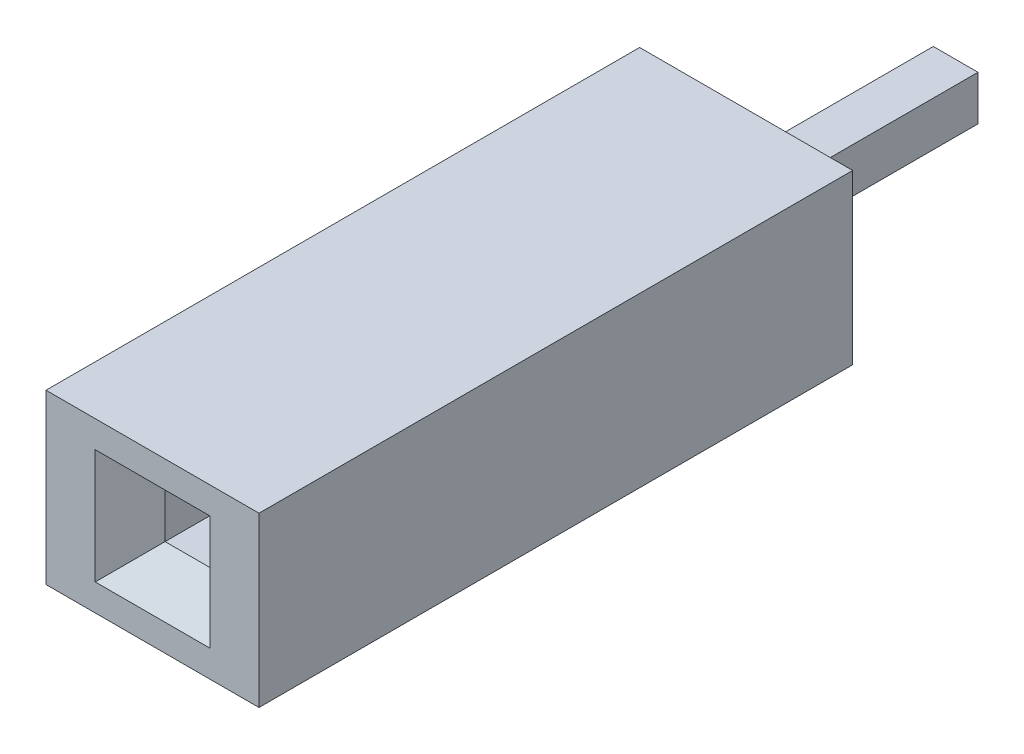
ISO-10303-21;
HEADER;
FILE_DESCRIPTION(('STEP AP214'),'2;1');
FILE_NAME('part.step','',(''),(''),'','','');
FILE_SCHEMA(('AUTOMOTIVE_DESIGN { 1 0 10303 214 1 1 1 1 }'));
ENDSEC;
DATA;
#1=APPLICATION_CONTEXT('core data for automotive mechanical design processes');
#2=APPLICATION_PROTOCOL_DEFINITION('international standard','automotive_design',2000,#1);
#3=PRODUCT_CONTEXT('',#1,'mechanical');
#4=PRODUCT('Part','Part','',(#3));
#5=PRODUCT_RELATED_PRODUCT_CATEGORY('part','',(#4));
#6=PRODUCT_DEFINITION_FORMATION('','',#4);
#7=PRODUCT_DEFINITION_CONTEXT('part definition',#1,'design');
#8=PRODUCT_DEFINITION('design','',#6,#7);
#9=PRODUCT_DEFINITION_SHAPE('','',#8);
#10=(LENGTH_UNIT() NAMED_UNIT(*) SI_UNIT(.MILLI.,.METRE.));
#11=(NAMED_UNIT(*) PLANE_ANGLE_UNIT() SI_UNIT($,.RADIAN.));
#12=(NAMED_UNIT(*) SI_UNIT($,.STERADIAN.) SOLID_ANGLE_UNIT());
#13=UNCERTAINTY_MEASURE_WITH_UNIT(LENGTH_MEASURE(1.E-05),#10,'distance_accuracy_value','');
#14=(GEOMETRIC_REPRESENTATION_CONTEXT(3) GLOBAL_UNCERTAINTY_ASSIGNED_CONTEXT((#13)) GLOBAL_UNIT_ASSIGNED_CONTEXT((#10,
#11,#12)) REPRESENTATION_CONTEXT('',''));
#15=CARTESIAN_POINT('',(0.,0.,0.));
#16=DIRECTION('',(0.,0.,1.));
#17=DIRECTION('',(1.,0.,0.));
#18=AXIS2_PLACEMENT_3D('',#15,#16,#17);
#19=CARTESIAN_POINT('',(0.,0.,0.));
#20=DIRECTION('',(0.,0.,1.));
#21=DIRECTION('',(1.,0.,0.));
#22=AXIS2_PLACEMENT_3D('',#19,#20,#21);
#23=PLANE('',#22);
#24=DIRECTION('',(0.,-1.,0.));
#25=VECTOR('',#24,1.);
#26=CARTESIAN_POINT('',(-1.525,1.205,0.));
#27=LINE('',#26,#25);
#28=CARTESIAN_POINT('',(-1.525,1.205,0.));
#29=VERTEX_POINT('',#28);
#30=CARTESIAN_POINT('',(-1.525,-1.205,0.));
#31=VERTEX_POINT('',#30);
#32=EDGE_CURVE('E207',#29,#31,#27,.T.);
#33=ORIENTED_EDGE('',*,*,#32,.F.);
#34=DIRECTION('',(1.,0.,0.));
#35=VECTOR('',#34,1.);
#36=CARTESIAN_POINT('',(-1.525,1.205,0.));
#37=LINE('',#36,#35);
#38=CARTESIAN_POINT('',(1.525,1.205,0.));
#39=VERTEX_POINT('',#38);
#40=EDGE_CURVE('E212',#29,#39,#37,.T.);
#41=ORIENTED_EDGE('',*,*,#40,.T.);
#42=DIRECTION('',(0.,-1.,0.));
#43=VECTOR('',#42,1.);
#44=CARTESIAN_POINT('',(1.525,1.205,0.));
#45=LINE('',#44,#43);
#46=CARTESIAN_POINT('',(1.525,-1.205,0.));
#47=VERTEX_POINT('',#46);
#48=EDGE_CURVE('E226',#39,#47,#45,.T.);
#49=ORIENTED_EDGE('',*,*,#48,.T.);
#50=DIRECTION('',(1.,0.,0.));
#51=VECTOR('',#50,1.);
#52=CARTESIAN_POINT('',(-1.525,-1.205,0.));
#53=LINE('',#52,#51);
#54=EDGE_CURVE('E223',#31,#47,#53,.T.);
#55=ORIENTED_EDGE('',*,*,#54,.F.);
#56=EDGE_LOOP('',(#33,#41,#49,#55));
#57=FACE_BOUND('',#56,.T.);
#58=DIRECTION('',(0.,1.,0.));
#59=VECTOR('',#58,1.);
#60=CARTESIAN_POINT('',(-0.32,0.,0.));
#61=LINE('',#60,#59);
#62=CARTESIAN_POINT('',(-0.32,-0.32,0.));
#63=VERTEX_POINT('',#62);
#64=CARTESIAN_POINT('',(-0.32,0.32,0.));
#65=VERTEX_POINT('',#64);
#66=EDGE_CURVE('E180',#63,#65,#61,.T.);
#67=ORIENTED_EDGE('',*,*,#66,.F.);
#68=DIRECTION('',(-1.,0.,0.));
#69=VECTOR('',#68,1.);
#70=CARTESIAN_POINT('',(0.32,-0.32,0.));
#71=LINE('',#70,#69);
#72=CARTESIAN_POINT('',(0.32,-0.32,0.));
#73=VERTEX_POINT('',#72);
#74=EDGE_CURVE('E162',#73,#63,#71,.T.);
#75=ORIENTED_EDGE('',*,*,#74,.F.);
#76=DIRECTION('',(0.,1.,0.));
#77=VECTOR('',#76,1.);
#78=CARTESIAN_POINT('',(0.32,0.,0.));
#79=LINE('',#78,#77);
#80=CARTESIAN_POINT('',(0.32,0.32,0.));
#81=VERTEX_POINT('',#80);
#82=EDGE_CURVE('E169',#73,#81,#79,.T.);
#83=ORIENTED_EDGE('',*,*,#82,.T.);
#84=DIRECTION('',(-1.,0.,0.));
#85=VECTOR('',#84,1.);
#86=CARTESIAN_POINT('',(0.32,0.32,0.));
#87=LINE('',#86,#85);
#88=EDGE_CURVE('E153',#81,#65,#87,.T.);
#89=ORIENTED_EDGE('',*,*,#88,.T.);
#90=EDGE_LOOP('',(#67,#75,#83,#89));
#91=FACE_BOUND('',#90,.T.);
#92=ADVANCED_FACE('F40',(#57,#91),#23,.F.);
#93=CARTESIAN_POINT('',(0.,0.,8.5));
#94=DIRECTION('',(0.,0.,1.));
#95=DIRECTION('',(1.,0.,0.));
#96=AXIS2_PLACEMENT_3D('',#93,#94,#95);
#97=PLANE('',#96);
#98=DIRECTION('',(1.,0.,0.));
#99=VECTOR('',#98,1.);
#100=CARTESIAN_POINT('',(0.32,0.82,8.5));
#101=LINE('',#100,#99);
#102=CARTESIAN_POINT('',(-0.820000000000001,0.82,8.5));
#103=VERTEX_POINT('',#102);
#104=CARTESIAN_POINT('',(0.82,0.82,8.5));
#105=VERTEX_POINT('',#104);
#106=EDGE_CURVE('E246',#103,#105,#101,.T.);
#107=ORIENTED_EDGE('',*,*,#106,.T.);
#108=DIRECTION('',(0.,-1.,0.));
#109=VECTOR('',#108,1.);
#110=CARTESIAN_POINT('',(0.82,-0.32,8.5));
#111=LINE('',#110,#109);
#112=CARTESIAN_POINT('',(0.82,-0.82,8.5));
#113=VERTEX_POINT('',#112);
#114=EDGE_CURVE('E248',#105,#113,#111,.T.);
#115=ORIENTED_EDGE('',*,*,#114,.T.);
#116=DIRECTION('',(-1.,0.,0.));
#117=VECTOR('',#116,1.);
#118=CARTESIAN_POINT('',(0.,-0.82,8.5));
#119=LINE('',#118,#117);
#120=CARTESIAN_POINT('',(-0.820000000000001,-0.82,8.5));
#121=VERTEX_POINT('',#120);
#122=EDGE_CURVE('E242',#113,#121,#119,.T.);
#123=ORIENTED_EDGE('',*,*,#122,.T.);
#124=DIRECTION('',(0.,1.,0.));
#125=VECTOR('',#124,1.);
#126=CARTESIAN_POINT('',(-0.820000000000001,0.,8.5));
#127=LINE('',#126,#125);
#128=EDGE_CURVE('E244',#121,#103,#127,.T.);
#129=ORIENTED_EDGE('',*,*,#128,.T.);
#130=EDGE_LOOP('',(#107,#115,#123,#129));
#131=FACE_BOUND('',#130,.T.);
#132=DIRECTION('',(0.,-1.,0.));
#133=VECTOR('',#132,1.);
#134=CARTESIAN_POINT('',(-1.525,1.205,8.5));
#135=LINE('',#134,#133);
#136=CARTESIAN_POINT('',(-1.525,1.205,8.5));
#137=VERTEX_POINT('',#136);
#138=CARTESIAN_POINT('',(-1.525,-1.205,8.5));
#139=VERTEX_POINT('',#138);
#140=EDGE_CURVE('E208',#137,#139,#135,.T.);
#141=ORIENTED_EDGE('',*,*,#140,.T.);
#142=DIRECTION('',(1.,0.,0.));
#143=VECTOR('',#142,1.);
#144=CARTESIAN_POINT('',(-1.525,-1.205,8.5));
#145=LINE('',#144,#143);
#146=CARTESIAN_POINT('',(1.525,-1.205,8.5));
#147=VERTEX_POINT('',#146);
#148=EDGE_CURVE('E211',#139,#147,#145,.T.);
#149=ORIENTED_EDGE('',*,*,#148,.T.);
#150=DIRECTION('',(0.,-1.,0.));
#151=VECTOR('',#150,1.);
#152=CARTESIAN_POINT('',(1.525,1.205,8.5));
#153=LINE('',#152,#151);
#154=CARTESIAN_POINT('',(1.525,1.205,8.5));
#155=VERTEX_POINT('',#154);
#156=EDGE_CURVE('E214',#155,#147,#153,.T.);
#157=ORIENTED_EDGE('',*,*,#156,.F.);
#158=DIRECTION('',(1.,0.,0.));
#159=VECTOR('',#158,1.);
#160=CARTESIAN_POINT('',(-1.525,1.205,8.5));
#161=LINE('',#160,#159);
#162=EDGE_CURVE('E217',#137,#155,#161,.T.);
#163=ORIENTED_EDGE('',*,*,#162,.F.);
#164=EDGE_LOOP('',(#141,#149,#157,#163));
#165=FACE_BOUND('',#164,.T.);
#166=ADVANCED_FACE('F317',(#131,#165),#97,.T.);
#167=CARTESIAN_POINT('',(-1.525,1.205,8.5));
#168=DIRECTION('',(1.,0.,0.));
#169=DIRECTION('',(0.,0.,-1.));
#170=AXIS2_PLACEMENT_3D('',#167,#168,#169);
#171=PLANE('',#170);
#172=ORIENTED_EDGE('',*,*,#32,.T.);
#173=DIRECTION('',(0.,0.,-1.));
#174=VECTOR('',#173,1.);
#175=CARTESIAN_POINT('',(-1.525,-1.205,8.5));
#176=LINE('',#175,#174);
#177=EDGE_CURVE('E236',#139,#31,#176,.T.);
#178=ORIENTED_EDGE('',*,*,#177,.F.);
#179=ORIENTED_EDGE('',*,*,#140,.F.);
#180=DIRECTION('',(0.,0.,-1.));
#181=VECTOR('',#180,1.);
#182=CARTESIAN_POINT('',(-1.525,1.205,8.5));
#183=LINE('',#182,#181);
#184=EDGE_CURVE('E220',#137,#29,#183,.T.);
#185=ORIENTED_EDGE('',*,*,#184,.T.);
#186=EDGE_LOOP('',(#172,#178,#179,#185));
#187=FACE_BOUND('',#186,.T.);
#188=ADVANCED_FACE('F323',(#187),#171,.F.);
#189=CARTESIAN_POINT('',(-1.525,-1.205,8.5));
#190=DIRECTION('',(0.,1.,0.));
#191=DIRECTION('',(0.,0.,1.));
#192=AXIS2_PLACEMENT_3D('',#189,#190,#191);
#193=PLANE('',#192);
#194=ORIENTED_EDGE('',*,*,#54,.T.);
#195=DIRECTION('',(0.,0.,-1.));
#196=VECTOR('',#195,1.);
#197=CARTESIAN_POINT('',(1.525,-1.205,8.5));
#198=LINE('',#197,#196);
#199=EDGE_CURVE('E234',#147,#47,#198,.T.);
#200=ORIENTED_EDGE('',*,*,#199,.F.);
#201=ORIENTED_EDGE('',*,*,#148,.F.);
#202=ORIENTED_EDGE('',*,*,#177,.T.);
#203=EDGE_LOOP('',(#194,#200,#201,#202));
#204=FACE_BOUND('',#203,.T.);
#205=ADVANCED_FACE('F337',(#204),#193,.F.);
#206=CARTESIAN_POINT('',(1.525,1.205,8.5));
#207=DIRECTION('',(1.,0.,0.));
#208=DIRECTION('',(0.,0.,-1.));
#209=AXIS2_PLACEMENT_3D('',#206,#207,#208);
#210=PLANE('',#209);
#211=ORIENTED_EDGE('',*,*,#48,.F.);
#212=DIRECTION('',(0.,0.,-1.));
#213=VECTOR('',#212,1.);
#214=CARTESIAN_POINT('',(1.525,1.205,8.5));
#215=LINE('',#214,#213);
#216=EDGE_CURVE('E232',#155,#39,#215,.T.);
#217=ORIENTED_EDGE('',*,*,#216,.F.);
#218=ORIENTED_EDGE('',*,*,#156,.T.);
#219=ORIENTED_EDGE('',*,*,#199,.T.);
#220=EDGE_LOOP('',(#211,#217,#218,#219));
#221=FACE_BOUND('',#220,.T.);
#222=ADVANCED_FACE('F333',(#221),#210,.T.);
#223=CARTESIAN_POINT('',(-1.525,1.205,8.5));
#224=DIRECTION('',(0.,1.,0.));
#225=DIRECTION('',(0.,0.,1.));
#226=AXIS2_PLACEMENT_3D('',#223,#224,#225);
#227=PLANE('',#226);
#228=ORIENTED_EDGE('',*,*,#40,.F.);
#229=ORIENTED_EDGE('',*,*,#184,.F.);
#230=ORIENTED_EDGE('',*,*,#162,.T.);
#231=ORIENTED_EDGE('',*,*,#216,.T.);
#232=EDGE_LOOP('',(#228,#229,#230,#231));
#233=FACE_BOUND('',#232,.T.);
#234=ADVANCED_FACE('F329',(#233),#227,.T.);
#235=CARTESIAN_POINT('',(-0.32,0.,3.5));
#236=DIRECTION('',(1.,0.,0.));
#237=DIRECTION('',(0.,0.,-1.));
#238=AXIS2_PLACEMENT_3D('',#235,#236,#237);
#239=PLANE('',#238);
#240=DIRECTION('',(0.,0.,1.));
#241=VECTOR('',#240,1.);
#242=CARTESIAN_POINT('',(-0.32,0.32,3.5));
#243=LINE('',#242,#241);
#244=CARTESIAN_POINT('',(-0.32,0.32,3.5));
#245=VERTEX_POINT('',#244);
#246=CARTESIAN_POINT('',(-0.32,0.32,8.));
#247=VERTEX_POINT('',#246);
#248=EDGE_CURVE('E204',#245,#247,#243,.T.);
#249=ORIENTED_EDGE('',*,*,#248,.T.);
#250=DIRECTION('',(0.,-1.,0.));
#251=VECTOR('',#250,1.);
#252=CARTESIAN_POINT('',(-0.32,0.,8.));
#253=LINE('',#252,#251);
#254=CARTESIAN_POINT('',(-0.32,-0.32,8.));
#255=VERTEX_POINT('',#254);
#256=EDGE_CURVE('E253',#247,#255,#253,.T.);
#257=ORIENTED_EDGE('',*,*,#256,.T.);
#258=DIRECTION('',(0.,0.,1.));
#259=VECTOR('',#258,1.);
#260=CARTESIAN_POINT('',(-0.32,-0.32,3.5));
#261=LINE('',#260,#259);
#262=CARTESIAN_POINT('',(-0.32,-0.32,3.5));
#263=VERTEX_POINT('',#262);
#264=EDGE_CURVE('E195',#263,#255,#261,.T.);
#265=ORIENTED_EDGE('',*,*,#264,.F.);
#266=DIRECTION('',(0.,1.,0.));
#267=VECTOR('',#266,1.);
#268=CARTESIAN_POINT('',(-0.32,0.,3.5));
#269=LINE('',#268,#267);
#270=EDGE_CURVE('E184',#263,#245,#269,.T.);
#271=ORIENTED_EDGE('',*,*,#270,.T.);
#272=EDGE_LOOP('',(#249,#257,#265,#271));
#273=FACE_BOUND('',#272,.T.);
#274=ADVANCED_FACE('F332',(#273),#239,.T.);
#275=CARTESIAN_POINT('',(0.,0.32,3.5));
#276=DIRECTION('',(0.,1.,0.));
#277=DIRECTION('',(0.,0.,1.));
#278=AXIS2_PLACEMENT_3D('',#275,#276,#277);
#279=PLANE('',#278);
#280=DIRECTION('',(0.,0.,1.));
#281=VECTOR('',#280,1.);
#282=CARTESIAN_POINT('',(0.32,0.32,3.5));
#283=LINE('',#282,#281);
#284=CARTESIAN_POINT('',(0.32,0.32,3.5));
#285=VERTEX_POINT('',#284);
#286=CARTESIAN_POINT('',(0.32,0.32,8.));
#287=VERTEX_POINT('',#286);
#288=EDGE_CURVE('E201',#285,#287,#283,.T.);
#289=ORIENTED_EDGE('',*,*,#288,.T.);
#290=DIRECTION('',(-1.,0.,0.));
#291=VECTOR('',#290,1.);
#292=CARTESIAN_POINT('',(-0.32,0.32,8.));
#293=LINE('',#292,#291);
#294=EDGE_CURVE('E251',#287,#247,#293,.T.);
#295=ORIENTED_EDGE('',*,*,#294,.T.);
#296=ORIENTED_EDGE('',*,*,#248,.F.);
#297=DIRECTION('',(-1.,0.,0.));
#298=VECTOR('',#297,1.);
#299=CARTESIAN_POINT('',(0.,0.32,3.5));
#300=LINE('',#299,#298);
#301=EDGE_CURVE('E186',#285,#245,#300,.T.);
#302=ORIENTED_EDGE('',*,*,#301,.F.);
#303=EDGE_LOOP('',(#289,#295,#296,#302));
#304=FACE_BOUND('',#303,.T.);
#305=ADVANCED_FACE('F477',(#304),#279,.F.);
#306=CARTESIAN_POINT('',(0.32,0.,3.5));
#307=DIRECTION('',(1.,0.,0.));
#308=DIRECTION('',(0.,1.,0.));
#309=AXIS2_PLACEMENT_3D('',#306,#307,#308);
#310=PLANE('',#309);
#311=DIRECTION('',(0.,0.,1.));
#312=VECTOR('',#311,1.);
#313=CARTESIAN_POINT('',(0.32,-0.32,3.5));
#314=LINE('',#313,#312);
#315=CARTESIAN_POINT('',(0.32,-0.32,3.5));
#316=VERTEX_POINT('',#315);
#317=CARTESIAN_POINT('',(0.32,-0.32,8.));
#318=VERTEX_POINT('',#317);
#319=EDGE_CURVE('E198',#316,#318,#314,.T.);
#320=ORIENTED_EDGE('',*,*,#319,.T.);
#321=DIRECTION('',(0.,1.,0.));
#322=VECTOR('',#321,1.);
#323=CARTESIAN_POINT('',(0.32,0.32,8.));
#324=LINE('',#323,#322);
#325=EDGE_CURVE('E239',#318,#287,#324,.T.);
#326=ORIENTED_EDGE('',*,*,#325,.T.);
#327=ORIENTED_EDGE('',*,*,#288,.F.);
#328=DIRECTION('',(0.,1.,0.));
#329=VECTOR('',#328,1.);
#330=CARTESIAN_POINT('',(0.32,0.,3.5));
#331=LINE('',#330,#329);
#332=EDGE_CURVE('E190',#316,#285,#331,.T.);
#333=ORIENTED_EDGE('',*,*,#332,.F.);
#334=EDGE_LOOP('',(#320,#326,#327,#333));
#335=FACE_BOUND('',#334,.T.);
#336=ADVANCED_FACE('F468',(#335),#310,.F.);
#337=CARTESIAN_POINT('',(0.,-0.32,3.5));
#338=DIRECTION('',(0.,1.,0.));
#339=DIRECTION('',(-1.,0.,0.));
#340=AXIS2_PLACEMENT_3D('',#337,#338,#339);
#341=PLANE('',#340);
#342=ORIENTED_EDGE('',*,*,#264,.T.);
#343=DIRECTION('',(1.,0.,0.));
#344=VECTOR('',#343,1.);
#345=CARTESIAN_POINT('',(0.,-0.32,8.));
#346=LINE('',#345,#344);
#347=EDGE_CURVE('E255',#255,#318,#346,.T.);
#348=ORIENTED_EDGE('',*,*,#347,.T.);
#349=ORIENTED_EDGE('',*,*,#319,.F.);
#350=DIRECTION('',(-1.,0.,0.));
#351=VECTOR('',#350,1.);
#352=CARTESIAN_POINT('',(0.,-0.32,3.5));
#353=LINE('',#352,#351);
#354=EDGE_CURVE('E193',#316,#263,#353,.T.);
#355=ORIENTED_EDGE('',*,*,#354,.T.);
#356=EDGE_LOOP('',(#342,#348,#349,#355));
#357=FACE_BOUND('',#356,.T.);
#358=ADVANCED_FACE('F460',(#357),#341,.T.);
#359=CARTESIAN_POINT('',(0.,0.,3.5));
#360=DIRECTION('',(0.,0.,1.));
#361=DIRECTION('',(1.,0.,0.));
#362=AXIS2_PLACEMENT_3D('',#359,#360,#361);
#363=PLANE('',#362);
#364=ORIENTED_EDGE('',*,*,#270,.F.);
#365=ORIENTED_EDGE('',*,*,#354,.F.);
#366=ORIENTED_EDGE('',*,*,#332,.T.);
#367=ORIENTED_EDGE('',*,*,#301,.T.);
#368=EDGE_LOOP('',(#364,#365,#366,#367));
#369=FACE_BOUND('',#368,.T.);
#370=ADVANCED_FACE('F355',(#369),#363,.T.);
#371=CARTESIAN_POINT('',(-0.820000000000001,0.,8.5));
#372=DIRECTION('',(-0.70710678118655,0.,-0.707106781186545));
#373=DIRECTION('',(0.,1.,0.));
#374=AXIS2_PLACEMENT_3D('',#371,#372,#373);
#375=PLANE('',#374);
#376=DIRECTION('',(0.577350269189624,-0.577350269189624,-0.577350269189628));
#377=VECTOR('',#376,1.);
#378=CARTESIAN_POINT('',(-0.213333333333334,0.213333333333334,7.89333333333333));
#379=LINE('',#378,#377);
#380=EDGE_CURVE('E261',#103,#247,#379,.T.);
#381=ORIENTED_EDGE('',*,*,#380,.F.);
#382=ORIENTED_EDGE('',*,*,#128,.F.);
#383=DIRECTION('',(-0.577350269189624,-0.577350269189624,0.577350269189628));
#384=VECTOR('',#383,1.);
#385=CARTESIAN_POINT('',(-0.546666666666668,-0.546666666666668,8.22666666666667));
#386=LINE('',#385,#384);
#387=EDGE_CURVE('E187',#255,#121,#386,.T.);
#388=ORIENTED_EDGE('',*,*,#387,.F.);
#389=ORIENTED_EDGE('',*,*,#256,.F.);
#390=EDGE_LOOP('',(#381,#382,#388,#389));
#391=FACE_BOUND('',#390,.T.);
#392=ADVANCED_FACE('F351',(#391),#375,.F.);
#393=CARTESIAN_POINT('',(0.,-0.82,8.5));
#394=DIRECTION('',(0.,-0.70710678118655,-0.707106781186545));
#395=DIRECTION('',(-1.,0.,0.));
#396=AXIS2_PLACEMENT_3D('',#393,#394,#395);
#397=PLANE('',#396);
#398=ORIENTED_EDGE('',*,*,#387,.T.);
#399=ORIENTED_EDGE('',*,*,#122,.F.);
#400=DIRECTION('',(0.577350269189624,-0.577350269189624,0.577350269189628));
#401=VECTOR('',#400,1.);
#402=CARTESIAN_POINT('',(0.213333333333334,-0.213333333333334,7.89333333333333));
#403=LINE('',#402,#401);
#404=EDGE_CURVE('E259',#318,#113,#403,.T.);
#405=ORIENTED_EDGE('',*,*,#404,.F.);
#406=ORIENTED_EDGE('',*,*,#347,.F.);
#407=EDGE_LOOP('',(#398,#399,#405,#406));
#408=FACE_BOUND('',#407,.T.);
#409=ADVANCED_FACE('F347',(#408),#397,.F.);
#410=CARTESIAN_POINT('',(0.,0.32,8.));
#411=DIRECTION('',(0.,-0.70710678118655,0.707106781186545));
#412=DIRECTION('',(1.,0.,0.));
#413=AXIS2_PLACEMENT_3D('',#410,#411,#412);
#414=PLANE('',#413);
#415=ORIENTED_EDGE('',*,*,#380,.T.);
#416=ORIENTED_EDGE('',*,*,#294,.F.);
#417=DIRECTION('',(0.577350269189624,0.577350269189624,0.577350269189628));
#418=VECTOR('',#417,1.);
#419=CARTESIAN_POINT('',(0.213333333333334,0.213333333333334,7.89333333333333));
#420=LINE('',#419,#418);
#421=EDGE_CURVE('E161',#105,#287,#420,.F.);
#422=ORIENTED_EDGE('',*,*,#421,.F.);
#423=ORIENTED_EDGE('',*,*,#106,.F.);
#424=EDGE_LOOP('',(#415,#416,#422,#423));
#425=FACE_BOUND('',#424,.T.);
#426=ADVANCED_FACE('F313',(#425),#414,.T.);
#427=CARTESIAN_POINT('',(0.32,0.,8.));
#428=DIRECTION('',(-0.70710678118655,0.,0.707106781186545));
#429=DIRECTION('',(0.,-1.,0.));
#430=AXIS2_PLACEMENT_3D('',#427,#428,#429);
#431=PLANE('',#430);
#432=ORIENTED_EDGE('',*,*,#404,.T.);
#433=ORIENTED_EDGE('',*,*,#114,.F.);
#434=ORIENTED_EDGE('',*,*,#421,.T.);
#435=ORIENTED_EDGE('',*,*,#325,.F.);
#436=EDGE_LOOP('',(#432,#433,#434,#435));
#437=FACE_BOUND('',#436,.T.);
#438=ADVANCED_FACE('F305',(#437),#431,.T.);
#439=CARTESIAN_POINT('',(0.32,0.,-3.2));
#440=DIRECTION('',(0.,0.,-1.));
#441=DIRECTION('',(-1.,0.,0.));
#442=AXIS2_PLACEMENT_3D('',#439,#440,#441);
#443=PLANE('',#442);
#444=DIRECTION('',(1.,0.,0.));
#445=VECTOR('',#444,1.);
#446=CARTESIAN_POINT('',(0.32,0.12,-3.2));
#447=LINE('',#446,#445);
#448=CARTESIAN_POINT('',(-0.12,0.12,-3.2));
#449=VERTEX_POINT('',#448);
#450=CARTESIAN_POINT('',(0.119999999999999,0.12,-3.2));
#451=VERTEX_POINT('',#450);
#452=EDGE_CURVE('E257',#449,#451,#447,.T.);
#453=ORIENTED_EDGE('',*,*,#452,.T.);
#454=DIRECTION('',(0.,-1.,0.));
#455=VECTOR('',#454,1.);
#456=CARTESIAN_POINT('',(0.119999999999999,0.,-3.2));
#457=LINE('',#456,#455);
#458=CARTESIAN_POINT('',(0.119999999999999,-0.119999999999999,-3.2));
#459=VERTEX_POINT('',#458);
#460=EDGE_CURVE('E271',#451,#459,#457,.T.);
#461=ORIENTED_EDGE('',*,*,#460,.T.);
#462=DIRECTION('',(-1.,0.,0.));
#463=VECTOR('',#462,1.);
#464=CARTESIAN_POINT('',(-0.32,-0.119999999999999,-3.2));
#465=LINE('',#464,#463);
#466=CARTESIAN_POINT('',(-0.12,-0.119999999999999,-3.2));
#467=VERTEX_POINT('',#466);
#468=EDGE_CURVE('E269',#459,#467,#465,.T.);
#469=ORIENTED_EDGE('',*,*,#468,.T.);
#470=DIRECTION('',(0.,1.,0.));
#471=VECTOR('',#470,1.);
#472=CARTESIAN_POINT('',(-0.12,0.32,-3.2));
#473=LINE('',#472,#471);
#474=EDGE_CURVE('E267',#467,#449,#473,.T.);
#475=ORIENTED_EDGE('',*,*,#474,.T.);
#476=EDGE_LOOP('',(#453,#461,#469,#475));
#477=FACE_BOUND('',#476,.T.);
#478=ADVANCED_FACE('F303',(#477),#443,.T.);
#479=CARTESIAN_POINT('',(0.32,0.32,0.));
#480=DIRECTION('',(0.,1.,0.));
#481=DIRECTION('',(0.,0.,1.));
#482=AXIS2_PLACEMENT_3D('',#479,#480,#481);
#483=PLANE('',#482);
#484=DIRECTION('',(0.,0.,-1.));
#485=VECTOR('',#484,1.);
#486=CARTESIAN_POINT('',(0.32,0.32,0.));
#487=LINE('',#486,#485);
#488=CARTESIAN_POINT('',(0.32,0.32,-3.));
#489=VERTEX_POINT('',#488);
#490=EDGE_CURVE('E156',#81,#489,#487,.T.);
#491=ORIENTED_EDGE('',*,*,#490,.T.);
#492=DIRECTION('',(-1.,0.,0.));
#493=VECTOR('',#492,1.);
#494=CARTESIAN_POINT('',(0.32,0.32,-3.));
#495=LINE('',#494,#493);
#496=CARTESIAN_POINT('',(-0.32,0.32,-3.));
#497=VERTEX_POINT('',#496);
#498=EDGE_CURVE('E11',#489,#497,#495,.T.);
#499=ORIENTED_EDGE('',*,*,#498,.T.);
#500=DIRECTION('',(0.,0.,-1.));
#501=VECTOR('',#500,1.);
#502=CARTESIAN_POINT('',(-0.32,0.32,0.));
#503=LINE('',#502,#501);
#504=EDGE_CURVE('E157',#65,#497,#503,.T.);
#505=ORIENTED_EDGE('',*,*,#504,.F.);
#506=ORIENTED_EDGE('',*,*,#88,.F.);
#507=EDGE_LOOP('',(#491,#499,#505,#506));
#508=FACE_BOUND('',#507,.T.);
#509=ADVANCED_FACE('F155',(#508),#483,.T.);
#510=CARTESIAN_POINT('',(0.32,-0.32,0.));
#511=DIRECTION('',(0.,1.,0.));
#512=DIRECTION('',(0.,0.,1.));
#513=AXIS2_PLACEMENT_3D('',#510,#511,#512);
#514=PLANE('',#513);
#515=DIRECTION('',(0.,0.,-1.));
#516=VECTOR('',#515,1.);
#517=CARTESIAN_POINT('',(-0.32,-0.32,0.));
#518=LINE('',#517,#516);
#519=CARTESIAN_POINT('',(-0.32,-0.32,-3.));
#520=VERTEX_POINT('',#519);
#521=EDGE_CURVE('E173',#63,#520,#518,.T.);
#522=ORIENTED_EDGE('',*,*,#521,.T.);
#523=DIRECTION('',(1.,0.,0.));
#524=VECTOR('',#523,1.);
#525=CARTESIAN_POINT('',(0.32,-0.32,-3.));
#526=LINE('',#525,#524);
#527=CARTESIAN_POINT('',(0.32,-0.32,-3.));
#528=VERTEX_POINT('',#527);
#529=EDGE_CURVE('E275',#520,#528,#526,.T.);
#530=ORIENTED_EDGE('',*,*,#529,.T.);
#531=DIRECTION('',(0.,0.,-1.));
#532=VECTOR('',#531,1.);
#533=CARTESIAN_POINT('',(0.32,-0.32,0.));
#534=LINE('',#533,#532);
#535=EDGE_CURVE('E175',#73,#528,#534,.T.);
#536=ORIENTED_EDGE('',*,*,#535,.F.);
#537=ORIENTED_EDGE('',*,*,#74,.T.);
#538=EDGE_LOOP('',(#522,#530,#536,#537));
#539=FACE_BOUND('',#538,.T.);
#540=ADVANCED_FACE('F298',(#539),#514,.F.);
#541=CARTESIAN_POINT('',(0.32,0.,0.));
#542=DIRECTION('',(1.,0.,0.));
#543=DIRECTION('',(0.,0.,-1.));
#544=AXIS2_PLACEMENT_3D('',#541,#542,#543);
#545=PLANE('',#544);
#546=ORIENTED_EDGE('',*,*,#535,.T.);
#547=DIRECTION('',(0.,1.,0.));
#548=VECTOR('',#547,1.);
#549=CARTESIAN_POINT('',(0.32,0.,-3.));
#550=LINE('',#549,#548);
#551=EDGE_CURVE('E172',#528,#489,#550,.T.);
#552=ORIENTED_EDGE('',*,*,#551,.T.);
#553=ORIENTED_EDGE('',*,*,#490,.F.);
#554=ORIENTED_EDGE('',*,*,#82,.F.);
#555=EDGE_LOOP('',(#546,#552,#553,#554));
#556=FACE_BOUND('',#555,.T.);
#557=ADVANCED_FACE('F168',(#556),#545,.T.);
#558=CARTESIAN_POINT('',(-0.32,0.,0.));
#559=DIRECTION('',(1.,0.,0.));
#560=DIRECTION('',(0.,0.,-1.));
#561=AXIS2_PLACEMENT_3D('',#558,#559,#560);
#562=PLANE('',#561);
#563=ORIENTED_EDGE('',*,*,#504,.T.);
#564=DIRECTION('',(0.,-1.,0.));
#565=VECTOR('',#564,1.);
#566=CARTESIAN_POINT('',(-0.32,-0.32,-3.));
#567=LINE('',#566,#565);
#568=EDGE_CURVE('E49',#497,#520,#567,.T.);
#569=ORIENTED_EDGE('',*,*,#568,.T.);
#570=ORIENTED_EDGE('',*,*,#521,.F.);
#571=ORIENTED_EDGE('',*,*,#66,.T.);
#572=EDGE_LOOP('',(#563,#569,#570,#571));
#573=FACE_BOUND('',#572,.T.);
#574=ADVANCED_FACE('F364',(#573),#562,.F.);
#575=CARTESIAN_POINT('',(-0.32,0.,-3.));
#576=DIRECTION('',(-0.707106781186547,0.,-0.707106781186547));
#577=DIRECTION('',(0.,1.,0.));
#578=AXIS2_PLACEMENT_3D('',#575,#576,#577);
#579=PLANE('',#578);
#580=DIRECTION('',(-0.577350269189626,-0.577350269189626,0.577350269189626));
#581=VECTOR('',#580,1.);
#582=CARTESIAN_POINT('',(-0.213333333333333,-0.213333333333333,-3.10666666666667));
#583=LINE('',#582,#581);
#584=EDGE_CURVE('E281',#520,#467,#583,.F.);
#585=ORIENTED_EDGE('',*,*,#584,.F.);
#586=ORIENTED_EDGE('',*,*,#568,.F.);
#587=DIRECTION('',(0.577350269189626,-0.577350269189626,-0.577350269189626));
#588=VECTOR('',#587,1.);
#589=CARTESIAN_POINT('',(-0.106666666666667,0.106666666666667,-3.21333333333333));
#590=LINE('',#589,#588);
#591=EDGE_CURVE('E44',#449,#497,#590,.F.);
#592=ORIENTED_EDGE('',*,*,#591,.F.);
#593=ORIENTED_EDGE('',*,*,#474,.F.);
#594=EDGE_LOOP('',(#585,#586,#592,#593));
#595=FACE_BOUND('',#594,.T.);
#596=ADVANCED_FACE('F42',(#595),#579,.T.);
#597=CARTESIAN_POINT('',(0.32,0.32,-3.));
#598=DIRECTION('',(0.,-0.707106781186548,0.707106781186547));
#599=DIRECTION('',(-1.,0.,0.));
#600=AXIS2_PLACEMENT_3D('',#597,#598,#599);
#601=PLANE('',#600);
#602=ORIENTED_EDGE('',*,*,#591,.T.);
#603=ORIENTED_EDGE('',*,*,#498,.F.);
#604=DIRECTION('',(-0.577350269189626,-0.577350269189626,-0.577350269189626));
#605=VECTOR('',#604,1.);
#606=CARTESIAN_POINT('',(0.32,0.32,-3.));
#607=LINE('',#606,#605);
#608=EDGE_CURVE('E280',#451,#489,#607,.F.);
#609=ORIENTED_EDGE('',*,*,#608,.F.);
#610=ORIENTED_EDGE('',*,*,#452,.F.);
#611=EDGE_LOOP('',(#602,#603,#609,#610));
#612=FACE_BOUND('',#611,.T.);
#613=ADVANCED_FACE('F291',(#612),#601,.F.);
#614=CARTESIAN_POINT('',(0.32,-0.119999999999999,-3.2));
#615=DIRECTION('',(0.,-0.707106781186548,-0.707106781186547));
#616=DIRECTION('',(1.,0.,0.));
#617=AXIS2_PLACEMENT_3D('',#614,#615,#616);
#618=PLANE('',#617);
#619=ORIENTED_EDGE('',*,*,#584,.T.);
#620=ORIENTED_EDGE('',*,*,#468,.F.);
#621=DIRECTION('',(-0.577350269189626,0.577350269189626,-0.577350269189626));
#622=VECTOR('',#621,1.);
#623=CARTESIAN_POINT('',(0.186666666666666,-0.186666666666666,-3.13333333333333));
#624=LINE('',#623,#622);
#625=EDGE_CURVE('E278',#528,#459,#624,.T.);
#626=ORIENTED_EDGE('',*,*,#625,.F.);
#627=ORIENTED_EDGE('',*,*,#529,.F.);
#628=EDGE_LOOP('',(#619,#620,#626,#627));
#629=FACE_BOUND('',#628,.T.);
#630=ADVANCED_FACE('F296',(#629),#618,.T.);
#631=CARTESIAN_POINT('',(0.119999999999999,0.,-3.2));
#632=DIRECTION('',(-0.707106781186547,0.,0.707106781186547));
#633=DIRECTION('',(0.,-1.,0.));
#634=AXIS2_PLACEMENT_3D('',#631,#632,#633);
#635=PLANE('',#634);
#636=ORIENTED_EDGE('',*,*,#608,.T.);
#637=ORIENTED_EDGE('',*,*,#551,.F.);
#638=ORIENTED_EDGE('',*,*,#625,.T.);
#639=ORIENTED_EDGE('',*,*,#460,.F.);
#640=EDGE_LOOP('',(#636,#637,#638,#639));
#641=FACE_BOUND('',#640,.T.);
#642=ADVANCED_FACE('F300',(#641),#635,.F.);
#643=CLOSED_SHELL('',(#92,#166,#188,#205,#222,#234,#274,#305,#336,#358,#370,#392,#409,#426,#438,
#478,#509,#540,#557,#574,#596,#613,#630,#642));
#644=MANIFOLD_SOLID_BREP('B2',#643);
#645=ADVANCED_BREP_SHAPE_REPRESENTATION('',(#18,#644),#14);
#646=SHAPE_DEFINITION_REPRESENTATION(#9,#645);
ENDSEC;
END-ISO-10303-21;
